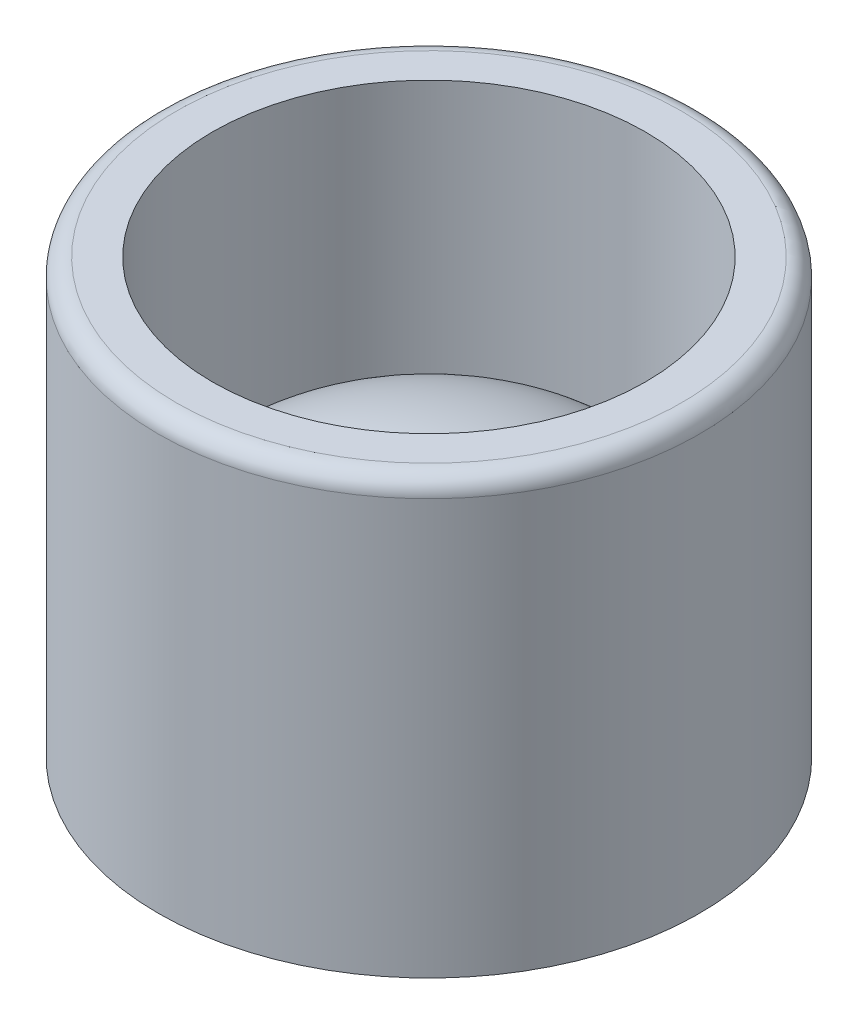
ISO-10303-21;
HEADER;
FILE_DESCRIPTION(('STEP AP214'),'2;1');
FILE_NAME('part.step','',(''),(''),'','','');
FILE_SCHEMA(('AUTOMOTIVE_DESIGN { 1 0 10303 214 1 1 1 1 }'));
ENDSEC;
DATA;
#1=APPLICATION_CONTEXT('core data for automotive mechanical design processes');
#2=APPLICATION_PROTOCOL_DEFINITION('international standard','automotive_design',2000,#1);
#3=PRODUCT_CONTEXT('',#1,'mechanical');
#4=PRODUCT('Part','Part','',(#3));
#5=PRODUCT_RELATED_PRODUCT_CATEGORY('part','',(#4));
#6=PRODUCT_DEFINITION_FORMATION('','',#4);
#7=PRODUCT_DEFINITION_CONTEXT('part definition',#1,'design');
#8=PRODUCT_DEFINITION('design','',#6,#7);
#9=PRODUCT_DEFINITION_SHAPE('','',#8);
#10=(LENGTH_UNIT() NAMED_UNIT(*) SI_UNIT(.MILLI.,.METRE.));
#11=(NAMED_UNIT(*) PLANE_ANGLE_UNIT() SI_UNIT($,.RADIAN.));
#12=(NAMED_UNIT(*) SI_UNIT($,.STERADIAN.) SOLID_ANGLE_UNIT());
#13=UNCERTAINTY_MEASURE_WITH_UNIT(LENGTH_MEASURE(1.E-05),#10,'distance_accuracy_value','');
#14=(GEOMETRIC_REPRESENTATION_CONTEXT(3) GLOBAL_UNCERTAINTY_ASSIGNED_CONTEXT((#13)) GLOBAL_UNIT_ASSIGNED_CONTEXT((#10,
#11,#12)) REPRESENTATION_CONTEXT('',''));
#15=CARTESIAN_POINT('',(0.,0.,0.));
#16=DIRECTION('',(0.,0.,1.));
#17=DIRECTION('',(1.,0.,0.));
#18=AXIS2_PLACEMENT_3D('',#15,#16,#17);
#19=CARTESIAN_POINT('',(0.,12.,0.));
#20=DIRECTION('',(0.,-1.,0.));
#21=DIRECTION('',(0.,0.,-1.));
#22=AXIS2_PLACEMENT_3D('',#19,#20,#21);
#23=CYLINDRICAL_SURFACE('',#22,7.5);
#24=CARTESIAN_POINT('',(0.,11.5,0.));
#25=DIRECTION('',(0.,1.,0.));
#26=DIRECTION('',(0.,0.,1.));
#27=AXIS2_PLACEMENT_3D('',#24,#25,#26);
#28=CIRCLE('',#27,7.5);
#29=CARTESIAN_POINT('',(0.,11.5,7.5));
#30=VERTEX_POINT('',#29);
#31=EDGE_CURVE('E11',#30,#30,#28,.F.);
#32=ORIENTED_EDGE('',*,*,#31,.T.);
#33=EDGE_LOOP('',(#32));
#34=FACE_BOUND('',#33,.T.);
#35=CARTESIAN_POINT('',(0.,0.,0.));
#36=DIRECTION('',(0.,1.,0.));
#37=DIRECTION('',(0.,0.,1.));
#38=AXIS2_PLACEMENT_3D('',#35,#36,#37);
#39=CIRCLE('',#38,7.5);
#40=CARTESIAN_POINT('',(0.,0.,7.5));
#41=VERTEX_POINT('',#40);
#42=EDGE_CURVE('E51',#41,#41,#39,.T.);
#43=ORIENTED_EDGE('',*,*,#42,.T.);
#44=EDGE_LOOP('',(#43));
#45=FACE_BOUND('',#44,.T.);
#46=ADVANCED_FACE('F33',(#34,#45),#23,.T.);
#47=CARTESIAN_POINT('',(0.,12.,0.));
#48=DIRECTION('',(0.,1.,0.));
#49=DIRECTION('',(0.,0.,1.));
#50=AXIS2_PLACEMENT_3D('',#47,#48,#49);
#51=PLANE('',#50);
#52=CARTESIAN_POINT('',(0.,12.,0.));
#53=DIRECTION('',(0.,1.,0.));
#54=DIRECTION('',(0.,0.,1.));
#55=AXIS2_PLACEMENT_3D('',#52,#53,#54);
#56=CIRCLE('',#55,7.);
#57=CARTESIAN_POINT('',(0.,12.,7.));
#58=VERTEX_POINT('',#57);
#59=EDGE_CURVE('E40',#58,#58,#56,.T.);
#60=ORIENTED_EDGE('',*,*,#59,.T.);
#61=EDGE_LOOP('',(#60));
#62=FACE_BOUND('',#61,.T.);
#63=CARTESIAN_POINT('',(0.,12.,0.));
#64=DIRECTION('',(0.,1.,0.));
#65=DIRECTION('',(0.,0.,1.));
#66=AXIS2_PLACEMENT_3D('',#63,#64,#65);
#67=CIRCLE('',#66,6.);
#68=CARTESIAN_POINT('',(0.,12.,6.));
#69=VERTEX_POINT('',#68);
#70=EDGE_CURVE('E52',#69,#69,#67,.T.);
#71=ORIENTED_EDGE('',*,*,#70,.F.);
#72=EDGE_LOOP('',(#71));
#73=FACE_BOUND('',#72,.T.);
#74=ADVANCED_FACE('F63',(#62,#73),#51,.T.);
#75=CARTESIAN_POINT('',(0.,0.,0.));
#76=DIRECTION('',(0.,1.,0.));
#77=DIRECTION('',(0.,0.,1.));
#78=AXIS2_PLACEMENT_3D('',#75,#76,#77);
#79=PLANE('',#78);
#80=ORIENTED_EDGE('',*,*,#42,.F.);
#81=EDGE_LOOP('',(#80));
#82=FACE_BOUND('',#81,.T.);
#83=ADVANCED_FACE('F65',(#82),#79,.F.);
#84=CARTESIAN_POINT('',(0.,4.,0.));
#85=DIRECTION('',(0.,1.,0.));
#86=DIRECTION('',(0.,0.,1.));
#87=AXIS2_PLACEMENT_3D('',#84,#85,#86);
#88=CYLINDRICAL_SURFACE('',#87,6.);
#89=CARTESIAN_POINT('',(0.,4.,0.));
#90=DIRECTION('',(0.,1.,0.));
#91=DIRECTION('',(0.,0.,1.));
#92=AXIS2_PLACEMENT_3D('',#89,#90,#91);
#93=CIRCLE('',#92,6.);
#94=CARTESIAN_POINT('',(0.,4.,6.));
#95=VERTEX_POINT('',#94);
#96=EDGE_CURVE('E49',#95,#95,#93,.T.);
#97=ORIENTED_EDGE('',*,*,#96,.F.);
#98=EDGE_LOOP('',(#97));
#99=FACE_BOUND('',#98,.T.);
#100=ORIENTED_EDGE('',*,*,#70,.T.);
#101=EDGE_LOOP('',(#100));
#102=FACE_BOUND('',#101,.T.);
#103=ADVANCED_FACE('F46',(#99,#102),#88,.F.);
#104=CARTESIAN_POINT('',(0.,4.,0.));
#105=DIRECTION('',(1.,0.,0.));
#106=DIRECTION('',(0.,0.,1.));
#107=AXIS2_PLACEMENT_3D('',#104,#105,#106);
#108=ELLIPSE('',#107,6.,3.);
#109=TRIMMED_CURVE('',#108,(PARAMETER_VALUE(4.71238898038469)),
(PARAMETER_VALUE(7.85398163397448)),.T.,.PARAMETER.);
#110=CARTESIAN_POINT('',(0.,1.,0.));
#111=DIRECTION('',(0.,1.,0.));
#112=AXIS1_PLACEMENT('',#110,#111);
#113=SURFACE_OF_REVOLUTION('',#109,#112);
#114=CARTESIAN_POINT('',(0.,7.,0.));
#115=VERTEX_POINT('',#114);
#116=VERTEX_LOOP('',#115);
#117=FACE_BOUND('',#116,.T.);
#118=ORIENTED_EDGE('',*,*,#96,.T.);
#119=EDGE_LOOP('',(#118));
#120=FACE_BOUND('',#119,.T.);
#121=ADVANCED_FACE('F43',(#117,#120),#113,.F.);
#122=CARTESIAN_POINT('',(0.,11.5,0.));
#123=DIRECTION('',(0.,1.,0.));
#124=DIRECTION('',(0.,0.,1.));
#125=AXIS2_PLACEMENT_3D('',#122,#123,#124);
#126=TOROIDAL_SURFACE('',#125,7.,0.5);
#127=ORIENTED_EDGE('',*,*,#31,.F.);
#128=EDGE_LOOP('',(#127));
#129=FACE_BOUND('',#128,.T.);
#130=ORIENTED_EDGE('',*,*,#59,.F.);
#131=EDGE_LOOP('',(#130));
#132=FACE_BOUND('',#131,.T.);
#133=ADVANCED_FACE('F35',(#129,#132),#126,.T.);
#134=CLOSED_SHELL('',(#46,#74,#83,#103,#121,#133));
#135=MANIFOLD_SOLID_BREP('B2',#134);
#136=ADVANCED_BREP_SHAPE_REPRESENTATION('',(#18,#135),#14);
#137=SHAPE_DEFINITION_REPRESENTATION(#9,#136);
ENDSEC;
END-ISO-10303-21;
